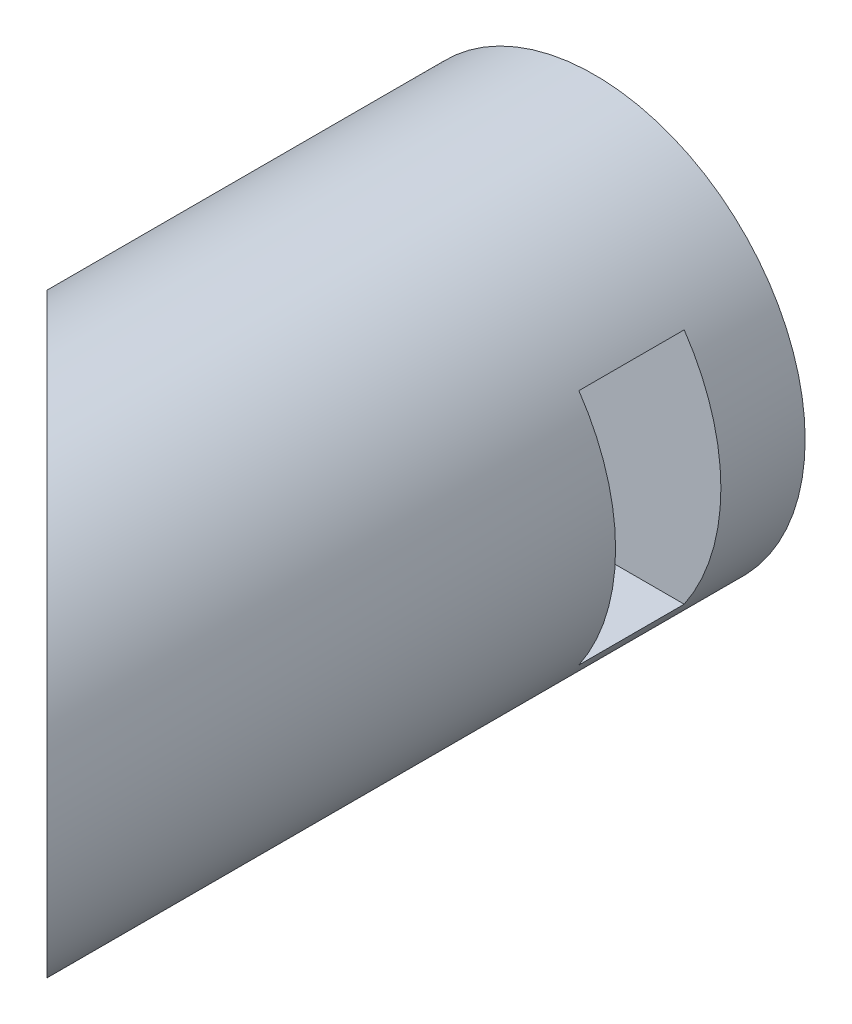
ISO-10303-21;
HEADER;
FILE_DESCRIPTION(('STEP AP214'),'2;1');
FILE_NAME('part.step','',(''),(''),'','','');
FILE_SCHEMA(('AUTOMOTIVE_DESIGN { 1 0 10303 214 1 1 1 1 }'));
ENDSEC;
DATA;
#1=APPLICATION_CONTEXT('core data for automotive mechanical design processes');
#2=APPLICATION_PROTOCOL_DEFINITION('international standard','automotive_design',2000,#1);
#3=PRODUCT_CONTEXT('',#1,'mechanical');
#4=PRODUCT('Part','Part','',(#3));
#5=PRODUCT_RELATED_PRODUCT_CATEGORY('part','',(#4));
#6=PRODUCT_DEFINITION_FORMATION('','',#4);
#7=PRODUCT_DEFINITION_CONTEXT('part definition',#1,'design');
#8=PRODUCT_DEFINITION('design','',#6,#7);
#9=PRODUCT_DEFINITION_SHAPE('','',#8);
#10=(LENGTH_UNIT() NAMED_UNIT(*) SI_UNIT(.MILLI.,.METRE.));
#11=(NAMED_UNIT(*) PLANE_ANGLE_UNIT() SI_UNIT($,.RADIAN.));
#12=(NAMED_UNIT(*) SI_UNIT($,.STERADIAN.) SOLID_ANGLE_UNIT());
#13=UNCERTAINTY_MEASURE_WITH_UNIT(LENGTH_MEASURE(1.E-05),#10,'distance_accuracy_value','');
#14=(GEOMETRIC_REPRESENTATION_CONTEXT(3) GLOBAL_UNCERTAINTY_ASSIGNED_CONTEXT((#13)) GLOBAL_UNIT_ASSIGNED_CONTEXT((#10,
#11,#12)) REPRESENTATION_CONTEXT('',''));
#15=CARTESIAN_POINT('',(0.,0.,0.));
#16=DIRECTION('',(0.,0.,1.));
#17=DIRECTION('',(1.,0.,0.));
#18=AXIS2_PLACEMENT_3D('',#15,#16,#17);
#19=CARTESIAN_POINT('',(0.,0.,18.));
#20=DIRECTION('',(0.,0.,-1.));
#21=DIRECTION('',(-1.,0.,0.));
#22=AXIS2_PLACEMENT_3D('',#19,#20,#21);
#23=CYLINDRICAL_SURFACE('',#22,5.);
#24=CARTESIAN_POINT('',(0.,0.,0.));
#25=DIRECTION('',(0.,0.,1.));
#26=DIRECTION('',(1.,0.,0.));
#27=AXIS2_PLACEMENT_3D('',#24,#25,#26);
#28=CIRCLE('',#27,5.);
#29=CARTESIAN_POINT('',(5.,0.,0.));
#30=VERTEX_POINT('',#29);
#31=EDGE_CURVE('E126',#30,#30,#28,.T.);
#32=ORIENTED_EDGE('',*,*,#31,.T.);
#33=EDGE_LOOP('',(#32));
#34=FACE_BOUND('',#33,.T.);
#35=CARTESIAN_POINT('',(0.,0.,13.));
#36=DIRECTION('',(-0.707106781186547,0.,0.707106781186548));
#37=DIRECTION('',(-0.707106781186548,0.,-0.707106781186547));
#38=AXIS2_PLACEMENT_3D('',#35,#36,#37);
#39=ELLIPSE('',#38,7.07106781186547,5.);
#40=CARTESIAN_POINT('',(-5.,0.,8.));
#41=VERTEX_POINT('',#40);
#42=EDGE_CURVE('E117',#41,#41,#39,.T.);
#43=ORIENTED_EDGE('',*,*,#42,.F.);
#44=EDGE_LOOP('',(#43));
#45=FACE_BOUND('',#44,.T.);
#46=CARTESIAN_POINT('',(0.,0.,4.5));
#47=DIRECTION('',(0.,0.,-1.));
#48=DIRECTION('',(0.,1.,0.));
#49=AXIS2_PLACEMENT_3D('',#46,#47,#48);
#50=CIRCLE('',#49,5.);
#51=CARTESIAN_POINT('',(4.12887393849703,2.82,4.5));
#52=VERTEX_POINT('',#51);
#53=CARTESIAN_POINT('',(4.12887393849703,-2.82,4.5));
#54=VERTEX_POINT('',#53);
#55=EDGE_CURVE('E130',#52,#54,#50,.T.);
#56=ORIENTED_EDGE('',*,*,#55,.F.);
#57=DIRECTION('',(0.,0.,-1.));
#58=VECTOR('',#57,1.);
#59=CARTESIAN_POINT('',(4.12887393849704,2.82,18.));
#60=LINE('',#59,#58);
#61=CARTESIAN_POINT('',(4.12887393849704,2.82,2.));
#62=VERTEX_POINT('',#61);
#63=EDGE_CURVE('E11',#62,#52,#60,.F.);
#64=ORIENTED_EDGE('',*,*,#63,.F.);
#65=CARTESIAN_POINT('',(0.,0.,2.));
#66=DIRECTION('',(0.,0.,1.));
#67=DIRECTION('',(0.,-1.,0.));
#68=AXIS2_PLACEMENT_3D('',#65,#66,#67);
#69=CIRCLE('',#68,5.);
#70=CARTESIAN_POINT('',(4.12887393849703,-2.82,2.));
#71=VERTEX_POINT('',#70);
#72=EDGE_CURVE('E62',#71,#62,#69,.T.);
#73=ORIENTED_EDGE('',*,*,#72,.F.);
#74=DIRECTION('',(0.,0.,-1.));
#75=VECTOR('',#74,1.);
#76=CARTESIAN_POINT('',(4.12887393849703,-2.82,18.));
#77=LINE('',#76,#75);
#78=EDGE_CURVE('E47',#54,#71,#77,.T.);
#79=ORIENTED_EDGE('',*,*,#78,.F.);
#80=EDGE_LOOP('',(#56,#64,#73,#79));
#81=FACE_BOUND('',#80,.T.);
#82=ADVANCED_FACE('F39',(#34,#45,#81),#23,.T.);
#83=CARTESIAN_POINT('',(0.,0.,0.));
#84=DIRECTION('',(0.,0.,1.));
#85=DIRECTION('',(1.,0.,0.));
#86=AXIS2_PLACEMENT_3D('',#83,#84,#85);
#87=PLANE('',#86);
#88=CARTESIAN_POINT('',(0.,0.,0.));
#89=DIRECTION('',(0.,0.,-1.));
#90=DIRECTION('',(-1.,0.,0.));
#91=AXIS2_PLACEMENT_3D('',#88,#89,#90);
#92=CIRCLE('',#91,1.6);
#93=CARTESIAN_POINT('',(-1.6,0.,0.));
#94=VERTEX_POINT('',#93);
#95=EDGE_CURVE('E99',#94,#94,#92,.T.);
#96=ORIENTED_EDGE('',*,*,#95,.F.);
#97=EDGE_LOOP('',(#96));
#98=FACE_BOUND('',#97,.T.);
#99=ORIENTED_EDGE('',*,*,#31,.F.);
#100=EDGE_LOOP('',(#99));
#101=FACE_BOUND('',#100,.T.);
#102=ADVANCED_FACE('F164',(#98,#101),#87,.F.);
#103=CARTESIAN_POINT('',(5.,5.,18.));
#104=DIRECTION('',(-0.707106781186547,0.,0.707106781186548));
#105=DIRECTION('',(0.707106781186548,0.,0.707106781186547));
#106=AXIS2_PLACEMENT_3D('',#103,#104,#105);
#107=PLANE('',#106);
#108=ORIENTED_EDGE('',*,*,#42,.T.);
#109=EDGE_LOOP('',(#108));
#110=FACE_BOUND('',#109,.T.);
#111=ADVANCED_FACE('F169',(#110),#107,.T.);
#112=CARTESIAN_POINT('',(5.,2.82,2.));
#113=DIRECTION('',(0.,0.,1.));
#114=DIRECTION('',(0.,-1.,0.));
#115=AXIS2_PLACEMENT_3D('',#112,#113,#114);
#116=PLANE('',#115);
#117=CARTESIAN_POINT('',(0.,0.,2.));
#118=DIRECTION('',(0.,0.,1.));
#119=DIRECTION('',(0.,-1.,0.));
#120=AXIS2_PLACEMENT_3D('',#117,#118,#119);
#121=CIRCLE('',#120,1.6);
#122=CARTESIAN_POINT('',(0.,-1.6,2.));
#123=VERTEX_POINT('',#122);
#124=EDGE_CURVE('E150',#123,#123,#121,.F.);
#125=ORIENTED_EDGE('',*,*,#124,.T.);
#126=EDGE_LOOP('',(#125));
#127=FACE_BOUND('',#126,.T.);
#128=DIRECTION('',(-1.,0.,0.));
#129=VECTOR('',#128,1.);
#130=CARTESIAN_POINT('',(5.,-2.82,2.));
#131=LINE('',#130,#129);
#132=CARTESIAN_POINT('',(-3.,-2.82,2.));
#133=VERTEX_POINT('',#132);
#134=EDGE_CURVE('E119',#71,#133,#131,.T.);
#135=ORIENTED_EDGE('',*,*,#134,.F.);
#136=ORIENTED_EDGE('',*,*,#72,.T.);
#137=DIRECTION('',(-1.,0.,0.));
#138=VECTOR('',#137,1.);
#139=CARTESIAN_POINT('',(5.,2.82,2.));
#140=LINE('',#139,#138);
#141=CARTESIAN_POINT('',(-3.,2.82,2.));
#142=VERTEX_POINT('',#141);
#143=EDGE_CURVE('E113',#62,#142,#140,.T.);
#144=ORIENTED_EDGE('',*,*,#143,.T.);
#145=DIRECTION('',(-0.427389440982642,-0.904067622325092,0.));
#146=VECTOR('',#145,1.);
#147=CARTESIAN_POINT('',(-3.,2.82,2.));
#148=LINE('',#147,#146);
#149=CARTESIAN_POINT('',(-4.33312840080635,0.,2.));
#150=VERTEX_POINT('',#149);
#151=EDGE_CURVE('E94',#142,#150,#148,.T.);
#152=ORIENTED_EDGE('',*,*,#151,.T.);
#153=DIRECTION('',(0.427389440982642,-0.904067622325092,0.));
#154=VECTOR('',#153,1.);
#155=CARTESIAN_POINT('',(-4.33312840080635,0.,2.));
#156=LINE('',#155,#154);
#157=EDGE_CURVE('E142',#150,#133,#156,.T.);
#158=ORIENTED_EDGE('',*,*,#157,.T.);
#159=EDGE_LOOP('',(#135,#136,#144,#152,#158));
#160=FACE_BOUND('',#159,.T.);
#161=ADVANCED_FACE('F140',(#127,#160),#116,.T.);
#162=CARTESIAN_POINT('',(5.,2.82,2.));
#163=DIRECTION('',(0.,-1.,0.));
#164=DIRECTION('',(0.,0.,-1.));
#165=AXIS2_PLACEMENT_3D('',#162,#163,#164);
#166=PLANE('',#165);
#167=ORIENTED_EDGE('',*,*,#63,.T.);
#168=DIRECTION('',(-1.,0.,0.));
#169=VECTOR('',#168,1.);
#170=CARTESIAN_POINT('',(5.,2.82,4.5));
#171=LINE('',#170,#169);
#172=CARTESIAN_POINT('',(-3.,2.82,4.5));
#173=VERTEX_POINT('',#172);
#174=EDGE_CURVE('E105',#52,#173,#171,.T.);
#175=ORIENTED_EDGE('',*,*,#174,.T.);
#176=DIRECTION('',(0.,0.,1.));
#177=VECTOR('',#176,1.);
#178=CARTESIAN_POINT('',(-3.,2.82,2.));
#179=LINE('',#178,#177);
#180=EDGE_CURVE('E88',#142,#173,#179,.T.);
#181=ORIENTED_EDGE('',*,*,#180,.F.);
#182=ORIENTED_EDGE('',*,*,#143,.F.);
#183=EDGE_LOOP('',(#167,#175,#181,#182));
#184=FACE_BOUND('',#183,.T.);
#185=ADVANCED_FACE('F110',(#184),#166,.T.);
#186=CARTESIAN_POINT('',(5.,2.82,4.5));
#187=DIRECTION('',(0.,0.,-1.));
#188=DIRECTION('',(0.,1.,0.));
#189=AXIS2_PLACEMENT_3D('',#186,#187,#188);
#190=PLANE('',#189);
#191=ORIENTED_EDGE('',*,*,#174,.F.);
#192=ORIENTED_EDGE('',*,*,#55,.T.);
#193=DIRECTION('',(-1.,0.,0.));
#194=VECTOR('',#193,1.);
#195=CARTESIAN_POINT('',(5.,-2.82,4.5));
#196=LINE('',#195,#194);
#197=CARTESIAN_POINT('',(-3.,-2.82,4.5));
#198=VERTEX_POINT('',#197);
#199=EDGE_CURVE('E54',#54,#198,#196,.T.);
#200=ORIENTED_EDGE('',*,*,#199,.T.);
#201=DIRECTION('',(0.427389440982642,-0.904067622325092,0.));
#202=VECTOR('',#201,1.);
#203=CARTESIAN_POINT('',(-4.33312840080635,0.,4.5));
#204=LINE('',#203,#202);
#205=CARTESIAN_POINT('',(-4.33312840080635,0.,4.5));
#206=VERTEX_POINT('',#205);
#207=EDGE_CURVE('E106',#206,#198,#204,.T.);
#208=ORIENTED_EDGE('',*,*,#207,.F.);
#209=DIRECTION('',(-0.427389440982642,-0.904067622325092,0.));
#210=VECTOR('',#209,1.);
#211=CARTESIAN_POINT('',(-3.,2.82,4.5));
#212=LINE('',#211,#210);
#213=EDGE_CURVE('E92',#173,#206,#212,.T.);
#214=ORIENTED_EDGE('',*,*,#213,.F.);
#215=EDGE_LOOP('',(#191,#192,#200,#208,#214));
#216=FACE_BOUND('',#215,.T.);
#217=ADVANCED_FACE('F104',(#216),#190,.T.);
#218=CARTESIAN_POINT('',(5.,-2.82,2.));
#219=DIRECTION('',(0.,1.,0.));
#220=DIRECTION('',(0.,0.,1.));
#221=AXIS2_PLACEMENT_3D('',#218,#219,#220);
#222=PLANE('',#221);
#223=ORIENTED_EDGE('',*,*,#78,.T.);
#224=ORIENTED_EDGE('',*,*,#134,.T.);
#225=DIRECTION('',(0.,0.,-1.));
#226=VECTOR('',#225,1.);
#227=CARTESIAN_POINT('',(-3.,-2.82,2.));
#228=LINE('',#227,#226);
#229=EDGE_CURVE('E98',#198,#133,#228,.T.);
#230=ORIENTED_EDGE('',*,*,#229,.F.);
#231=ORIENTED_EDGE('',*,*,#199,.F.);
#232=EDGE_LOOP('',(#223,#224,#230,#231));
#233=FACE_BOUND('',#232,.T.);
#234=ADVANCED_FACE('F137',(#233),#222,.T.);
#235=CARTESIAN_POINT('',(0.,0.,18.001));
#236=DIRECTION('',(0.,0.,-1.));
#237=DIRECTION('',(-1.,0.,0.));
#238=AXIS2_PLACEMENT_3D('',#235,#236,#237);
#239=CYLINDRICAL_SURFACE('',#238,1.6);
#240=ORIENTED_EDGE('',*,*,#124,.F.);
#241=EDGE_LOOP('',(#240));
#242=FACE_BOUND('',#241,.T.);
#243=ORIENTED_EDGE('',*,*,#95,.T.);
#244=EDGE_LOOP('',(#243));
#245=FACE_BOUND('',#244,.T.);
#246=ADVANCED_FACE('F189',(#242,#245),#239,.F.);
#247=CARTESIAN_POINT('',(-4.33312840080635,0.,4.5));
#248=DIRECTION('',(0.904067622325092,0.427389440982642,0.));
#249=DIRECTION('',(-0.427389440982642,0.904067622325092,0.));
#250=AXIS2_PLACEMENT_3D('',#247,#248,#249);
#251=PLANE('',#250);
#252=ORIENTED_EDGE('',*,*,#157,.F.);
#253=DIRECTION('',(0.,0.,-1.));
#254=VECTOR('',#253,1.);
#255=CARTESIAN_POINT('',(-4.33312840080635,0.,4.5));
#256=LINE('',#255,#254);
#257=EDGE_CURVE('E108',#206,#150,#256,.T.);
#258=ORIENTED_EDGE('',*,*,#257,.F.);
#259=ORIENTED_EDGE('',*,*,#207,.T.);
#260=ORIENTED_EDGE('',*,*,#229,.T.);
#261=EDGE_LOOP('',(#252,#258,#259,#260));
#262=FACE_BOUND('',#261,.T.);
#263=ADVANCED_FACE('F162',(#262),#251,.T.);
#264=CARTESIAN_POINT('',(-3.,2.82,4.5));
#265=DIRECTION('',(0.904067622325092,-0.427389440982642,0.));
#266=DIRECTION('',(0.427389440982642,0.904067622325092,0.));
#267=AXIS2_PLACEMENT_3D('',#264,#265,#266);
#268=PLANE('',#267);
#269=ORIENTED_EDGE('',*,*,#151,.F.);
#270=ORIENTED_EDGE('',*,*,#180,.T.);
#271=ORIENTED_EDGE('',*,*,#213,.T.);
#272=ORIENTED_EDGE('',*,*,#257,.T.);
#273=EDGE_LOOP('',(#269,#270,#271,#272));
#274=FACE_BOUND('',#273,.T.);
#275=ADVANCED_FACE('F90',(#274),#268,.T.);
#276=CLOSED_SHELL('',(#82,#102,#111,#161,#185,#217,#234,#246,#263,#275));
#277=MANIFOLD_SOLID_BREP('B2',#276);
#278=ADVANCED_BREP_SHAPE_REPRESENTATION('',(#18,#277),#14);
#279=SHAPE_DEFINITION_REPRESENTATION(#9,#278);
ENDSEC;
END-ISO-10303-21;
